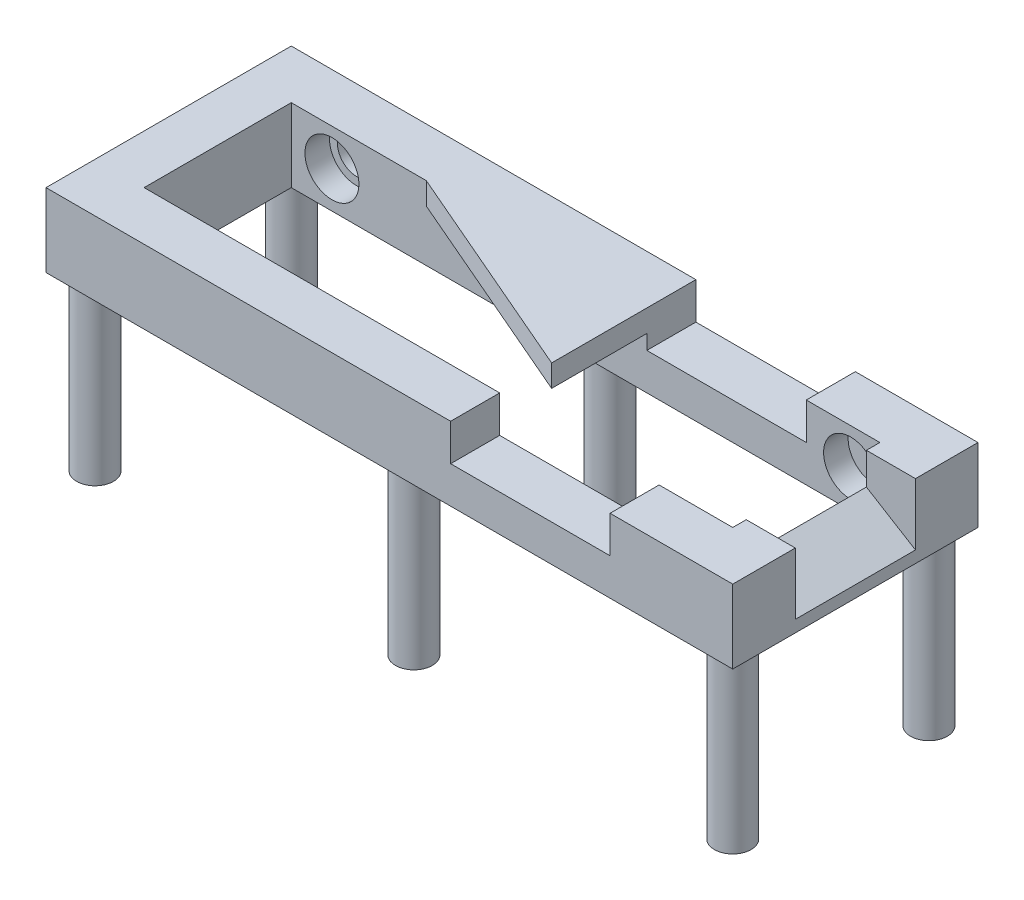
ISO-10303-21;
HEADER;
FILE_DESCRIPTION(('STEP AP214'),'2;1');
FILE_NAME('part.step','',(''),(''),'','','');
FILE_SCHEMA(('AUTOMOTIVE_DESIGN { 1 0 10303 214 1 1 1 1 }'));
ENDSEC;
DATA;
#1=APPLICATION_CONTEXT('core data for automotive mechanical design processes');
#2=APPLICATION_PROTOCOL_DEFINITION('international standard','automotive_design',2000,#1);
#3=PRODUCT_CONTEXT('',#1,'mechanical');
#4=PRODUCT('Part','Part','',(#3));
#5=PRODUCT_RELATED_PRODUCT_CATEGORY('part','',(#4));
#6=PRODUCT_DEFINITION_FORMATION('','',#4);
#7=PRODUCT_DEFINITION_CONTEXT('part definition',#1,'design');
#8=PRODUCT_DEFINITION('design','',#6,#7);
#9=PRODUCT_DEFINITION_SHAPE('','',#8);
#10=(LENGTH_UNIT() NAMED_UNIT(*) SI_UNIT(.MILLI.,.METRE.));
#11=(NAMED_UNIT(*) PLANE_ANGLE_UNIT() SI_UNIT($,.RADIAN.));
#12=(NAMED_UNIT(*) SI_UNIT($,.STERADIAN.) SOLID_ANGLE_UNIT());
#13=UNCERTAINTY_MEASURE_WITH_UNIT(LENGTH_MEASURE(1.E-05),#10,'distance_accuracy_value','');
#14=(GEOMETRIC_REPRESENTATION_CONTEXT(3) GLOBAL_UNCERTAINTY_ASSIGNED_CONTEXT((#13)) GLOBAL_UNIT_ASSIGNED_CONTEXT((#10,
#11,#12)) REPRESENTATION_CONTEXT('',''));
#15=CARTESIAN_POINT('',(0.,0.,0.));
#16=DIRECTION('',(0.,0.,1.));
#17=DIRECTION('',(1.,0.,0.));
#18=AXIS2_PLACEMENT_3D('',#15,#16,#17);
#19=CARTESIAN_POINT('',(0.,30.,0.));
#20=DIRECTION('',(0.,-1.,0.));
#21=DIRECTION('',(0.,0.,-1.));
#22=AXIS2_PLACEMENT_3D('',#19,#20,#21);
#23=PLANE('',#22);
#24=DIRECTION('',(-1.,0.,0.));
#25=VECTOR('',#24,1.);
#26=CARTESIAN_POINT('',(0.,30.,-54.5));
#27=LINE('',#26,#25);
#28=CARTESIAN_POINT('',(260.,30.,-54.5));
#29=VERTEX_POINT('',#28);
#30=CARTESIAN_POINT('',(240.,30.,-54.5));
#31=VERTEX_POINT('',#30);
#32=EDGE_CURVE('E324',#29,#31,#27,.T.);
#33=ORIENTED_EDGE('',*,*,#32,.F.);
#34=DIRECTION('',(0.,0.,-1.));
#35=VECTOR('',#34,1.);
#36=CARTESIAN_POINT('',(260.,30.,20.));
#37=LINE('',#36,#35);
#38=CARTESIAN_POINT('',(260.,30.,-80.));
#39=VERTEX_POINT('',#38);
#40=EDGE_CURVE('E257',#29,#39,#37,.T.);
#41=ORIENTED_EDGE('',*,*,#40,.T.);
#42=DIRECTION('',(-1.,0.,0.));
#43=VECTOR('',#42,1.);
#44=CARTESIAN_POINT('',(-20.,30.,-80.));
#45=LINE('',#44,#43);
#46=CARTESIAN_POINT('',(209.978221097427,30.,-80.));
#47=VERTEX_POINT('',#46);
#48=EDGE_CURVE('E262',#39,#47,#45,.T.);
#49=ORIENTED_EDGE('',*,*,#48,.T.);
#50=DIRECTION('',(0.,0.,1.));
#51=VECTOR('',#50,1.);
#52=CARTESIAN_POINT('',(209.978221097427,30.,-99.));
#53=LINE('',#52,#51);
#54=CARTESIAN_POINT('',(209.978221097427,30.,-60.));
#55=VERTEX_POINT('',#54);
#56=EDGE_CURVE('E345',#47,#55,#53,.T.);
#57=ORIENTED_EDGE('',*,*,#56,.T.);
#58=DIRECTION('',(-1.,0.,0.));
#59=VECTOR('',#58,1.);
#60=CARTESIAN_POINT('',(0.,30.,-59.9999999999999));
#61=LINE('',#60,#59);
#62=CARTESIAN_POINT('',(240.,30.,-60.));
#63=VERTEX_POINT('',#62);
#64=EDGE_CURVE('E218',#63,#55,#61,.T.);
#65=ORIENTED_EDGE('',*,*,#64,.F.);
#66=DIRECTION('',(0.,0.,-1.));
#67=VECTOR('',#66,1.);
#68=CARTESIAN_POINT('',(240.,30.,0.));
#69=LINE('',#68,#67);
#70=EDGE_CURVE('E224',#31,#63,#69,.T.);
#71=ORIENTED_EDGE('',*,*,#70,.F.);
#72=EDGE_LOOP('',(#33,#41,#49,#57,#65,#71));
#73=FACE_BOUND('',#72,.T.);
#74=ADVANCED_FACE('F36',(#73),#23,.F.);
#75=CARTESIAN_POINT('',(260.,30.,20.));
#76=DIRECTION('',(-1.,0.,0.));
#77=DIRECTION('',(0.,0.,1.));
#78=AXIS2_PLACEMENT_3D('',#75,#76,#77);
#79=PLANE('',#78);
#80=DIRECTION('',(0.,1.,0.));
#81=VECTOR('',#80,1.);
#82=CARTESIAN_POINT('',(260.,0.,-54.5));
#83=LINE('',#82,#81);
#84=CARTESIAN_POINT('',(260.,4.80107313806603,-54.5));
#85=VERTEX_POINT('',#84);
#86=EDGE_CURVE('E330',#85,#29,#83,.T.);
#87=ORIENTED_EDGE('',*,*,#86,.F.);
#88=DIRECTION('',(0.,0.,1.));
#89=VECTOR('',#88,1.);
#90=CARTESIAN_POINT('',(260.,4.80107313806603,-54.5));
#91=LINE('',#90,#89);
#92=CARTESIAN_POINT('',(260.,4.80107313806603,-5.49999999999998));
#93=VERTEX_POINT('',#92);
#94=EDGE_CURVE('E325',#85,#93,#91,.T.);
#95=ORIENTED_EDGE('',*,*,#94,.T.);
#96=DIRECTION('',(0.,1.,0.));
#97=VECTOR('',#96,1.);
#98=CARTESIAN_POINT('',(260.,0.,-5.49999999999998));
#99=LINE('',#98,#97);
#100=CARTESIAN_POINT('',(260.,30.,-5.49999999999998));
#101=VERTEX_POINT('',#100);
#102=EDGE_CURVE('E488',#93,#101,#99,.T.);
#103=ORIENTED_EDGE('',*,*,#102,.T.);
#104=CARTESIAN_POINT('',(260.,30.,20.));
#105=VERTEX_POINT('',#104);
#106=EDGE_CURVE('E258',#105,#101,#37,.T.);
#107=ORIENTED_EDGE('',*,*,#106,.F.);
#108=DIRECTION('',(0.,-1.,0.));
#109=VECTOR('',#108,1.);
#110=CARTESIAN_POINT('',(260.,30.,20.));
#111=LINE('',#110,#109);
#112=CARTESIAN_POINT('',(260.,0.,20.));
#113=VERTEX_POINT('',#112);
#114=EDGE_CURVE('E278',#105,#113,#111,.T.);
#115=ORIENTED_EDGE('',*,*,#114,.T.);
#116=DIRECTION('',(0.,0.,-1.));
#117=VECTOR('',#116,1.);
#118=CARTESIAN_POINT('',(260.,0.,20.));
#119=LINE('',#118,#117);
#120=CARTESIAN_POINT('',(260.,0.,-80.));
#121=VERTEX_POINT('',#120);
#122=EDGE_CURVE('E270',#113,#121,#119,.T.);
#123=ORIENTED_EDGE('',*,*,#122,.T.);
#124=DIRECTION('',(0.,-1.,0.));
#125=VECTOR('',#124,1.);
#126=CARTESIAN_POINT('',(260.,30.,-80.));
#127=LINE('',#126,#125);
#128=EDGE_CURVE('E275',#39,#121,#127,.T.);
#129=ORIENTED_EDGE('',*,*,#128,.F.);
#130=ORIENTED_EDGE('',*,*,#40,.F.);
#131=EDGE_LOOP('',(#87,#95,#103,#107,#115,#123,#129,#130));
#132=FACE_BOUND('',#131,.T.);
#133=ADVANCED_FACE('F492',(#132),#79,.F.);
#134=CARTESIAN_POINT('',(240.,30.,0.));
#135=DIRECTION('',(-1.,0.,0.));
#136=DIRECTION('',(0.,0.,1.));
#137=AXIS2_PLACEMENT_3D('',#134,#135,#136);
#138=PLANE('',#137);
#139=DIRECTION('',(0.,0.,1.));
#140=VECTOR('',#139,1.);
#141=CARTESIAN_POINT('',(240.,17.0214416943566,0.));
#142=LINE('',#141,#140);
#143=CARTESIAN_POINT('',(240.,17.0214416943566,-54.5));
#144=VERTEX_POINT('',#143);
#145=CARTESIAN_POINT('',(240.,17.0214416943566,-5.49999999999998));
#146=VERTEX_POINT('',#145);
#147=EDGE_CURVE('E45',#144,#146,#142,.T.);
#148=ORIENTED_EDGE('',*,*,#147,.F.);
#149=DIRECTION('',(0.,1.,0.));
#150=VECTOR('',#149,1.);
#151=CARTESIAN_POINT('',(240.,30.,-54.5));
#152=LINE('',#151,#150);
#153=EDGE_CURVE('E11',#144,#31,#152,.T.);
#154=ORIENTED_EDGE('',*,*,#153,.T.);
#155=ORIENTED_EDGE('',*,*,#70,.T.);
#156=DIRECTION('',(0.,-1.,0.));
#157=VECTOR('',#156,1.);
#158=CARTESIAN_POINT('',(240.,30.,-60.));
#159=LINE('',#158,#157);
#160=CARTESIAN_POINT('',(240.,0.,-60.));
#161=VERTEX_POINT('',#160);
#162=EDGE_CURVE('E242',#63,#161,#159,.T.);
#163=ORIENTED_EDGE('',*,*,#162,.T.);
#164=DIRECTION('',(0.,0.,-1.));
#165=VECTOR('',#164,1.);
#166=CARTESIAN_POINT('',(240.,0.,0.));
#167=LINE('',#166,#165);
#168=CARTESIAN_POINT('',(240.,0.,0.));
#169=VERTEX_POINT('',#168);
#170=EDGE_CURVE('E235',#169,#161,#167,.T.);
#171=ORIENTED_EDGE('',*,*,#170,.F.);
#172=DIRECTION('',(0.,-1.,0.));
#173=VECTOR('',#172,1.);
#174=CARTESIAN_POINT('',(240.,30.,0.));
#175=LINE('',#174,#173);
#176=CARTESIAN_POINT('',(240.,30.,0.));
#177=VERTEX_POINT('',#176);
#178=EDGE_CURVE('E244',#177,#169,#175,.T.);
#179=ORIENTED_EDGE('',*,*,#178,.F.);
#180=CARTESIAN_POINT('',(240.,30.,-5.49999999999998));
#181=VERTEX_POINT('',#180);
#182=EDGE_CURVE('E219',#177,#181,#69,.T.);
#183=ORIENTED_EDGE('',*,*,#182,.T.);
#184=DIRECTION('',(0.,1.,0.));
#185=VECTOR('',#184,1.);
#186=CARTESIAN_POINT('',(240.,30.,-5.49999999999998));
#187=LINE('',#186,#185);
#188=EDGE_CURVE('E303',#146,#181,#187,.T.);
#189=ORIENTED_EDGE('',*,*,#188,.F.);
#190=EDGE_LOOP('',(#148,#154,#155,#163,#171,#179,#183,#189));
#191=FACE_BOUND('',#190,.T.);
#192=ADVANCED_FACE('F313',(#191),#138,.T.);
#193=DIRECTION('',(1.,0.,0.));
#194=VECTOR('',#193,1.);
#195=CARTESIAN_POINT('',(-20.,30.,20.));
#196=LINE('',#195,#194);
#197=CARTESIAN_POINT('',(-20.,30.,20.));
#198=VERTEX_POINT('',#197);
#199=CARTESIAN_POINT('',(144.978221097427,30.,20.));
#200=VERTEX_POINT('',#199);
#201=EDGE_CURVE('E255',#198,#200,#196,.T.);
#202=ORIENTED_EDGE('',*,*,#201,.T.);
#203=DIRECTION('',(0.,0.,1.));
#204=VECTOR('',#203,1.);
#205=CARTESIAN_POINT('',(144.978221097427,30.,-99.));
#206=LINE('',#205,#204);
#207=CARTESIAN_POINT('',(144.978221097427,30.,0.));
#208=VERTEX_POINT('',#207);
#209=EDGE_CURVE('E342',#208,#200,#206,.T.);
#210=ORIENTED_EDGE('',*,*,#209,.F.);
#211=DIRECTION('',(1.,0.,0.));
#212=VECTOR('',#211,1.);
#213=CARTESIAN_POINT('',(0.,30.,0.));
#214=LINE('',#213,#212);
#215=CARTESIAN_POINT('',(0.,30.,0.));
#216=VERTEX_POINT('',#215);
#217=EDGE_CURVE('E430',#216,#208,#214,.T.);
#218=ORIENTED_EDGE('',*,*,#217,.F.);
#219=DIRECTION('',(0.,0.,1.));
#220=VECTOR('',#219,1.);
#221=CARTESIAN_POINT('',(0.,30.,0.));
#222=LINE('',#221,#220);
#223=CARTESIAN_POINT('',(0.,30.,-59.9999999999999));
#224=VERTEX_POINT('',#223);
#225=EDGE_CURVE('E217',#224,#216,#222,.T.);
#226=ORIENTED_EDGE('',*,*,#225,.F.);
#227=CARTESIAN_POINT('',(55.057032044271,30.,-60.));
#228=VERTEX_POINT('',#227);
#229=EDGE_CURVE('E209',#228,#224,#61,.T.);
#230=ORIENTED_EDGE('',*,*,#229,.F.);
#231=DIRECTION('',(0.918082968206384,0.,0.396388273652683));
#232=VECTOR('',#231,1.);
#233=CARTESIAN_POINT('',(55.057032044271,30.,-60.));
#234=LINE('',#233,#232);
#235=CARTESIAN_POINT('',(144.978221097427,30.,-21.1759436478682));
#236=VERTEX_POINT('',#235);
#237=EDGE_CURVE('E192',#228,#236,#234,.T.);
#238=ORIENTED_EDGE('',*,*,#237,.T.);
#239=CARTESIAN_POINT('',(144.978221097427,30.,-80.));
#240=VERTEX_POINT('',#239);
#241=EDGE_CURVE('E344',#240,#236,#206,.T.);
#242=ORIENTED_EDGE('',*,*,#241,.F.);
#243=CARTESIAN_POINT('',(-20.,30.,-80.));
#244=VERTEX_POINT('',#243);
#245=EDGE_CURVE('E261',#240,#244,#45,.T.);
#246=ORIENTED_EDGE('',*,*,#245,.T.);
#247=DIRECTION('',(0.,0.,1.));
#248=VECTOR('',#247,1.);
#249=CARTESIAN_POINT('',(-20.,30.,20.));
#250=LINE('',#249,#248);
#251=EDGE_CURVE('E250',#244,#198,#250,.T.);
#252=ORIENTED_EDGE('',*,*,#251,.T.);
#253=EDGE_LOOP('',(#202,#210,#218,#226,#230,#238,#242,#246,#252));
#254=FACE_BOUND('',#253,.T.);
#255=ADVANCED_FACE('F215',(#254),#23,.F.);
#256=ORIENTED_EDGE('',*,*,#106,.T.);
#257=DIRECTION('',(-1.,0.,0.));
#258=VECTOR('',#257,1.);
#259=CARTESIAN_POINT('',(0.,30.,-5.49999999999998));
#260=LINE('',#259,#258);
#261=EDGE_CURVE('E318',#101,#181,#260,.T.);
#262=ORIENTED_EDGE('',*,*,#261,.T.);
#263=ORIENTED_EDGE('',*,*,#182,.F.);
#264=CARTESIAN_POINT('',(209.978221097427,30.,0.));
#265=VERTEX_POINT('',#264);
#266=EDGE_CURVE('E429',#265,#177,#214,.T.);
#267=ORIENTED_EDGE('',*,*,#266,.F.);
#268=CARTESIAN_POINT('',(209.978221097427,30.,20.));
#269=VERTEX_POINT('',#268);
#270=EDGE_CURVE('E346',#265,#269,#53,.T.);
#271=ORIENTED_EDGE('',*,*,#270,.T.);
#272=EDGE_CURVE('E253',#269,#105,#196,.T.);
#273=ORIENTED_EDGE('',*,*,#272,.T.);
#274=EDGE_LOOP('',(#256,#262,#263,#267,#271,#273));
#275=FACE_BOUND('',#274,.T.);
#276=ADVANCED_FACE('F321',(#275),#23,.F.);
#277=CARTESIAN_POINT('',(0.,0.,0.));
#278=DIRECTION('',(0.,-1.,0.));
#279=DIRECTION('',(0.,0.,-1.));
#280=AXIS2_PLACEMENT_3D('',#277,#278,#279);
#281=PLANE('',#280);
#282=CARTESIAN_POINT('',(120.,0.,-70.));
#283=DIRECTION('',(0.,-1.,0.));
#284=DIRECTION('',(0.,0.,-1.));
#285=AXIS2_PLACEMENT_3D('',#282,#283,#284);
#286=CIRCLE('',#285,7.50000000000001);
#287=CARTESIAN_POINT('',(120.,0.,-77.5));
#288=VERTEX_POINT('',#287);
#289=EDGE_CURVE('E394',#288,#288,#286,.T.);
#290=ORIENTED_EDGE('',*,*,#289,.F.);
#291=EDGE_LOOP('',(#290));
#292=FACE_BOUND('',#291,.T.);
#293=CARTESIAN_POINT('',(120.,0.,10.));
#294=DIRECTION('',(0.,-1.,0.));
#295=DIRECTION('',(0.,0.,-1.));
#296=AXIS2_PLACEMENT_3D('',#293,#294,#295);
#297=CIRCLE('',#296,7.50000000000001);
#298=CARTESIAN_POINT('',(120.,0.,2.49999999999999));
#299=VERTEX_POINT('',#298);
#300=EDGE_CURVE('E398',#299,#299,#297,.T.);
#301=ORIENTED_EDGE('',*,*,#300,.F.);
#302=EDGE_LOOP('',(#301));
#303=FACE_BOUND('',#302,.T.);
#304=CARTESIAN_POINT('',(250.,0.,-70.));
#305=DIRECTION('',(0.,-1.,0.));
#306=DIRECTION('',(0.,0.,-1.));
#307=AXIS2_PLACEMENT_3D('',#304,#305,#306);
#308=CIRCLE('',#307,7.50000000000001);
#309=CARTESIAN_POINT('',(250.,0.,-77.5));
#310=VERTEX_POINT('',#309);
#311=EDGE_CURVE('E404',#310,#310,#308,.T.);
#312=ORIENTED_EDGE('',*,*,#311,.F.);
#313=EDGE_LOOP('',(#312));
#314=FACE_BOUND('',#313,.T.);
#315=CARTESIAN_POINT('',(-10.,0.,-70.));
#316=DIRECTION('',(0.,-1.,0.));
#317=DIRECTION('',(0.,0.,1.));
#318=AXIS2_PLACEMENT_3D('',#315,#316,#317);
#319=CIRCLE('',#318,7.5);
#320=CARTESIAN_POINT('',(-10.,0.,-62.5));
#321=VERTEX_POINT('',#320);
#322=EDGE_CURVE('E410',#321,#321,#319,.T.);
#323=ORIENTED_EDGE('',*,*,#322,.F.);
#324=EDGE_LOOP('',(#323));
#325=FACE_BOUND('',#324,.T.);
#326=CARTESIAN_POINT('',(250.,0.,10.));
#327=DIRECTION('',(0.,-1.,0.));
#328=DIRECTION('',(0.,0.,1.));
#329=AXIS2_PLACEMENT_3D('',#326,#327,#328);
#330=CIRCLE('',#329,7.50000000000001);
#331=CARTESIAN_POINT('',(250.,0.,17.5));
#332=VERTEX_POINT('',#331);
#333=EDGE_CURVE('E416',#332,#332,#330,.T.);
#334=ORIENTED_EDGE('',*,*,#333,.F.);
#335=EDGE_LOOP('',(#334));
#336=FACE_BOUND('',#335,.T.);
#337=CARTESIAN_POINT('',(-10.,0.,10.));
#338=DIRECTION('',(0.,-1.,0.));
#339=DIRECTION('',(0.,0.,-1.));
#340=AXIS2_PLACEMENT_3D('',#337,#338,#339);
#341=CIRCLE('',#340,7.5);
#342=CARTESIAN_POINT('',(-10.,0.,2.5));
#343=VERTEX_POINT('',#342);
#344=EDGE_CURVE('E422',#343,#343,#341,.T.);
#345=ORIENTED_EDGE('',*,*,#344,.F.);
#346=EDGE_LOOP('',(#345));
#347=FACE_BOUND('',#346,.T.);
#348=DIRECTION('',(0.,0.,1.));
#349=VECTOR('',#348,1.);
#350=CARTESIAN_POINT('',(-20.,0.,20.));
#351=LINE('',#350,#349);
#352=CARTESIAN_POINT('',(-20.,0.,-80.));
#353=VERTEX_POINT('',#352);
#354=CARTESIAN_POINT('',(-20.,0.,20.));
#355=VERTEX_POINT('',#354);
#356=EDGE_CURVE('E249',#353,#355,#351,.T.);
#357=ORIENTED_EDGE('',*,*,#356,.F.);
#358=DIRECTION('',(-1.,0.,0.));
#359=VECTOR('',#358,1.);
#360=CARTESIAN_POINT('',(-20.,0.,-80.));
#361=LINE('',#360,#359);
#362=EDGE_CURVE('E254',#121,#353,#361,.T.);
#363=ORIENTED_EDGE('',*,*,#362,.F.);
#364=ORIENTED_EDGE('',*,*,#122,.F.);
#365=DIRECTION('',(1.,0.,0.));
#366=VECTOR('',#365,1.);
#367=CARTESIAN_POINT('',(-20.,0.,20.));
#368=LINE('',#367,#366);
#369=EDGE_CURVE('E268',#355,#113,#368,.T.);
#370=ORIENTED_EDGE('',*,*,#369,.F.);
#371=EDGE_LOOP('',(#357,#363,#364,#370));
#372=FACE_BOUND('',#371,.T.);
#373=DIRECTION('',(-1.,0.,0.));
#374=VECTOR('',#373,1.);
#375=CARTESIAN_POINT('',(0.,0.,-59.9999999999999));
#376=LINE('',#375,#374);
#377=CARTESIAN_POINT('',(0.,0.,-59.9999999999999));
#378=VERTEX_POINT('',#377);
#379=EDGE_CURVE('E238',#161,#378,#376,.T.);
#380=ORIENTED_EDGE('',*,*,#379,.T.);
#381=DIRECTION('',(0.,0.,1.));
#382=VECTOR('',#381,1.);
#383=CARTESIAN_POINT('',(0.,0.,0.));
#384=LINE('',#383,#382);
#385=CARTESIAN_POINT('',(0.,0.,0.));
#386=VERTEX_POINT('',#385);
#387=EDGE_CURVE('E228',#378,#386,#384,.T.);
#388=ORIENTED_EDGE('',*,*,#387,.T.);
#389=DIRECTION('',(1.,0.,0.));
#390=VECTOR('',#389,1.);
#391=CARTESIAN_POINT('',(0.,0.,0.));
#392=LINE('',#391,#390);
#393=EDGE_CURVE('E231',#386,#169,#392,.T.);
#394=ORIENTED_EDGE('',*,*,#393,.T.);
#395=ORIENTED_EDGE('',*,*,#170,.T.);
#396=EDGE_LOOP('',(#380,#388,#394,#395));
#397=FACE_BOUND('',#396,.T.);
#398=ADVANCED_FACE('F443',(#292,#303,#314,#325,#336,#347,#372,#397),#281,.T.);
#399=CARTESIAN_POINT('',(-20.,30.,20.));
#400=DIRECTION('',(1.,0.,0.));
#401=DIRECTION('',(0.,0.,-1.));
#402=AXIS2_PLACEMENT_3D('',#399,#400,#401);
#403=PLANE('',#402);
#404=ORIENTED_EDGE('',*,*,#356,.T.);
#405=DIRECTION('',(0.,-1.,0.));
#406=VECTOR('',#405,1.);
#407=CARTESIAN_POINT('',(-20.,30.,20.));
#408=LINE('',#407,#406);
#409=EDGE_CURVE('E281',#198,#355,#408,.T.);
#410=ORIENTED_EDGE('',*,*,#409,.F.);
#411=ORIENTED_EDGE('',*,*,#251,.F.);
#412=DIRECTION('',(0.,-1.,0.));
#413=VECTOR('',#412,1.);
#414=CARTESIAN_POINT('',(-20.,30.,-80.));
#415=LINE('',#414,#413);
#416=EDGE_CURVE('E265',#244,#353,#415,.T.);
#417=ORIENTED_EDGE('',*,*,#416,.T.);
#418=EDGE_LOOP('',(#404,#410,#411,#417));
#419=FACE_BOUND('',#418,.T.);
#420=ADVANCED_FACE('F38',(#419),#403,.F.);
#421=CARTESIAN_POINT('',(-20.,30.,20.));
#422=DIRECTION('',(0.,0.,-1.));
#423=DIRECTION('',(-1.,0.,0.));
#424=AXIS2_PLACEMENT_3D('',#421,#422,#423);
#425=PLANE('',#424);
#426=DIRECTION('',(1.,0.,0.));
#427=VECTOR('',#426,1.);
#428=CARTESIAN_POINT('',(144.978221097427,15.,20.));
#429=LINE('',#428,#427);
#430=CARTESIAN_POINT('',(144.978221097427,15.,20.));
#431=VERTEX_POINT('',#430);
#432=CARTESIAN_POINT('',(209.978221097427,15.,20.));
#433=VERTEX_POINT('',#432);
#434=EDGE_CURVE('E336',#431,#433,#429,.T.);
#435=ORIENTED_EDGE('',*,*,#434,.F.);
#436=DIRECTION('',(0.,-1.,0.));
#437=VECTOR('',#436,1.);
#438=CARTESIAN_POINT('',(144.978221097427,30.,20.));
#439=LINE('',#438,#437);
#440=EDGE_CURVE('E327',#200,#431,#439,.T.);
#441=ORIENTED_EDGE('',*,*,#440,.F.);
#442=ORIENTED_EDGE('',*,*,#201,.F.);
#443=ORIENTED_EDGE('',*,*,#409,.T.);
#444=ORIENTED_EDGE('',*,*,#369,.T.);
#445=ORIENTED_EDGE('',*,*,#114,.F.);
#446=ORIENTED_EDGE('',*,*,#272,.F.);
#447=DIRECTION('',(0.,1.,0.));
#448=VECTOR('',#447,1.);
#449=CARTESIAN_POINT('',(209.978221097427,15.,20.));
#450=LINE('',#449,#448);
#451=EDGE_CURVE('E339',#433,#269,#450,.T.);
#452=ORIENTED_EDGE('',*,*,#451,.F.);
#453=EDGE_LOOP('',(#435,#441,#442,#443,#444,#445,#446,#452));
#454=FACE_BOUND('',#453,.T.);
#455=ADVANCED_FACE('F509',(#454),#425,.F.);
#456=CARTESIAN_POINT('',(-20.,30.,-80.));
#457=DIRECTION('',(0.,0.,1.));
#458=DIRECTION('',(1.,0.,0.));
#459=AXIS2_PLACEMENT_3D('',#456,#457,#458);
#460=PLANE('',#459);
#461=CARTESIAN_POINT('',(16.5795411374058,15.,-80.));
#462=DIRECTION('',(0.,0.,-1.));
#463=DIRECTION('',(-1.,0.,0.));
#464=AXIS2_PLACEMENT_3D('',#461,#462,#463);
#465=CIRCLE('',#464,7.75);
#466=CARTESIAN_POINT('',(8.82954113740582,15.,-80.));
#467=VERTEX_POINT('',#466);
#468=EDGE_CURVE('E897',#467,#467,#465,.T.);
#469=ORIENTED_EDGE('',*,*,#468,.F.);
#470=EDGE_LOOP('',(#469));
#471=FACE_BOUND('',#470,.T.);
#472=ORIENTED_EDGE('',*,*,#245,.F.);
#473=DIRECTION('',(0.,-1.,0.));
#474=VECTOR('',#473,1.);
#475=CARTESIAN_POINT('',(144.978221097427,30.,-80.));
#476=LINE('',#475,#474);
#477=CARTESIAN_POINT('',(144.978221097427,15.,-80.));
#478=VERTEX_POINT('',#477);
#479=EDGE_CURVE('E367',#240,#478,#476,.T.);
#480=ORIENTED_EDGE('',*,*,#479,.T.);
#481=DIRECTION('',(1.,0.,0.));
#482=VECTOR('',#481,1.);
#483=CARTESIAN_POINT('',(-20.,15.,-80.));
#484=LINE('',#483,#482);
#485=CARTESIAN_POINT('',(209.978221097427,15.,-80.));
#486=VERTEX_POINT('',#485);
#487=EDGE_CURVE('E356',#478,#486,#484,.T.);
#488=ORIENTED_EDGE('',*,*,#487,.T.);
#489=DIRECTION('',(0.,1.,0.));
#490=VECTOR('',#489,1.);
#491=CARTESIAN_POINT('',(209.978221097427,30.,-80.));
#492=LINE('',#491,#490);
#493=EDGE_CURVE('E362',#486,#47,#492,.T.);
#494=ORIENTED_EDGE('',*,*,#493,.T.);
#495=ORIENTED_EDGE('',*,*,#48,.F.);
#496=ORIENTED_EDGE('',*,*,#128,.T.);
#497=ORIENTED_EDGE('',*,*,#362,.T.);
#498=ORIENTED_EDGE('',*,*,#416,.F.);
#499=EDGE_LOOP('',(#472,#480,#488,#494,#495,#496,#497,#498));
#500=FACE_BOUND('',#499,.T.);
#501=ADVANCED_FACE('F459',(#471,#500),#460,.F.);
#502=CARTESIAN_POINT('',(0.,30.,0.));
#503=DIRECTION('',(1.,0.,0.));
#504=DIRECTION('',(0.,0.,-1.));
#505=AXIS2_PLACEMENT_3D('',#502,#503,#504);
#506=PLANE('',#505);
#507=ORIENTED_EDGE('',*,*,#387,.F.);
#508=DIRECTION('',(0.,-1.,0.));
#509=VECTOR('',#508,1.);
#510=CARTESIAN_POINT('',(0.,30.,-59.9999999999999));
#511=LINE('',#510,#509);
#512=EDGE_CURVE('E222',#224,#378,#511,.T.);
#513=ORIENTED_EDGE('',*,*,#512,.F.);
#514=ORIENTED_EDGE('',*,*,#225,.T.);
#515=DIRECTION('',(0.,-1.,0.));
#516=VECTOR('',#515,1.);
#517=CARTESIAN_POINT('',(0.,30.,0.));
#518=LINE('',#517,#516);
#519=EDGE_CURVE('E246',#216,#386,#518,.T.);
#520=ORIENTED_EDGE('',*,*,#519,.T.);
#521=EDGE_LOOP('',(#507,#513,#514,#520));
#522=FACE_BOUND('',#521,.T.);
#523=ADVANCED_FACE('F445',(#522),#506,.T.);
#524=CARTESIAN_POINT('',(0.,30.,0.));
#525=DIRECTION('',(0.,0.,-1.));
#526=DIRECTION('',(-1.,0.,0.));
#527=AXIS2_PLACEMENT_3D('',#524,#525,#526);
#528=PLANE('',#527);
#529=DIRECTION('',(0.,1.,0.));
#530=VECTOR('',#529,1.);
#531=CARTESIAN_POINT('',(144.978221097427,30.,0.));
#532=LINE('',#531,#530);
#533=CARTESIAN_POINT('',(144.978221097427,15.,0.));
#534=VERTEX_POINT('',#533);
#535=EDGE_CURVE('E365',#534,#208,#532,.T.);
#536=ORIENTED_EDGE('',*,*,#535,.F.);
#537=DIRECTION('',(-1.,0.,0.));
#538=VECTOR('',#537,1.);
#539=CARTESIAN_POINT('',(0.,15.,0.));
#540=LINE('',#539,#538);
#541=CARTESIAN_POINT('',(209.978221097427,15.,0.));
#542=VERTEX_POINT('',#541);
#543=EDGE_CURVE('E354',#542,#534,#540,.T.);
#544=ORIENTED_EDGE('',*,*,#543,.F.);
#545=DIRECTION('',(0.,-1.,0.));
#546=VECTOR('',#545,1.);
#547=CARTESIAN_POINT('',(209.978221097427,30.,0.));
#548=LINE('',#547,#546);
#549=EDGE_CURVE('E359',#265,#542,#548,.T.);
#550=ORIENTED_EDGE('',*,*,#549,.F.);
#551=ORIENTED_EDGE('',*,*,#266,.T.);
#552=ORIENTED_EDGE('',*,*,#178,.T.);
#553=ORIENTED_EDGE('',*,*,#393,.F.);
#554=ORIENTED_EDGE('',*,*,#519,.F.);
#555=ORIENTED_EDGE('',*,*,#217,.T.);
#556=EDGE_LOOP('',(#536,#544,#550,#551,#552,#553,#554,#555));
#557=FACE_BOUND('',#556,.T.);
#558=CARTESIAN_POINT('',(228.036930768266,15.,0.));
#559=DIRECTION('',(0.,0.,-1.));
#560=DIRECTION('',(-1.,0.,0.));
#561=AXIS2_PLACEMENT_3D('',#558,#559,#560);
#562=CIRCLE('',#561,11.);
#563=CARTESIAN_POINT('',(217.036930768266,15.,0.));
#564=VERTEX_POINT('',#563);
#565=EDGE_CURVE('E297',#564,#564,#562,.T.);
#566=ORIENTED_EDGE('',*,*,#565,.F.);
#567=EDGE_LOOP('',(#566));
#568=FACE_BOUND('',#567,.T.);
#569=CARTESIAN_POINT('',(16.5795411374058,15.,0.));
#570=DIRECTION('',(0.,0.,-1.));
#571=DIRECTION('',(-1.,0.,0.));
#572=AXIS2_PLACEMENT_3D('',#569,#570,#571);
#573=CIRCLE('',#572,11.);
#574=CARTESIAN_POINT('',(5.57954113740582,15.,0.));
#575=VERTEX_POINT('',#574);
#576=EDGE_CURVE('E293',#575,#575,#573,.T.);
#577=ORIENTED_EDGE('',*,*,#576,.F.);
#578=EDGE_LOOP('',(#577));
#579=FACE_BOUND('',#578,.T.);
#580=CARTESIAN_POINT('',(95.4698805058518,15.,0.));
#581=DIRECTION('',(0.,0.,-1.));
#582=DIRECTION('',(-1.,0.,0.));
#583=AXIS2_PLACEMENT_3D('',#580,#581,#582);
#584=CIRCLE('',#583,11.);
#585=CARTESIAN_POINT('',(84.4698805058518,15.,0.));
#586=VERTEX_POINT('',#585);
#587=EDGE_CURVE('E288',#586,#586,#584,.T.);
#588=ORIENTED_EDGE('',*,*,#587,.F.);
#589=EDGE_LOOP('',(#588));
#590=FACE_BOUND('',#589,.T.);
#591=ADVANCED_FACE('F436',(#557,#568,#579,#590),#528,.T.);
#592=CARTESIAN_POINT('',(0.,30.,-59.9999999999999));
#593=DIRECTION('',(0.,0.,1.));
#594=DIRECTION('',(1.,0.,0.));
#595=AXIS2_PLACEMENT_3D('',#592,#593,#594);
#596=PLANE('',#595);
#597=DIRECTION('',(0.,1.,0.));
#598=VECTOR('',#597,1.);
#599=CARTESIAN_POINT('',(55.057032044271,21.,-60.));
#600=LINE('',#599,#598);
#601=CARTESIAN_POINT('',(55.057032044271,21.,-60.));
#602=VERTEX_POINT('',#601);
#603=EDGE_CURVE('E196',#602,#228,#600,.T.);
#604=ORIENTED_EDGE('',*,*,#603,.T.);
#605=ORIENTED_EDGE('',*,*,#229,.T.);
#606=ORIENTED_EDGE('',*,*,#512,.T.);
#607=ORIENTED_EDGE('',*,*,#379,.F.);
#608=ORIENTED_EDGE('',*,*,#162,.F.);
#609=ORIENTED_EDGE('',*,*,#64,.T.);
#610=DIRECTION('',(0.,1.,0.));
#611=VECTOR('',#610,1.);
#612=CARTESIAN_POINT('',(209.978221097427,30.,-60.));
#613=LINE('',#612,#611);
#614=CARTESIAN_POINT('',(209.978221097427,15.,-60.));
#615=VERTEX_POINT('',#614);
#616=EDGE_CURVE('E299',#615,#55,#613,.T.);
#617=ORIENTED_EDGE('',*,*,#616,.F.);
#618=DIRECTION('',(1.,0.,0.));
#619=VECTOR('',#618,1.);
#620=CARTESIAN_POINT('',(0.,15.,-59.9999999999999));
#621=LINE('',#620,#619);
#622=CARTESIAN_POINT('',(144.978221097427,15.,-60.));
#623=VERTEX_POINT('',#622);
#624=EDGE_CURVE('E284',#623,#615,#621,.T.);
#625=ORIENTED_EDGE('',*,*,#624,.F.);
#626=DIRECTION('',(0.,-1.,0.));
#627=VECTOR('',#626,1.);
#628=CARTESIAN_POINT('',(144.978221097427,30.,-60.));
#629=LINE('',#628,#627);
#630=CARTESIAN_POINT('',(144.978221097427,21.,-60.));
#631=VERTEX_POINT('',#630);
#632=EDGE_CURVE('E301',#631,#623,#629,.T.);
#633=ORIENTED_EDGE('',*,*,#632,.F.);
#634=DIRECTION('',(-1.,0.,0.));
#635=VECTOR('',#634,1.);
#636=CARTESIAN_POINT('',(144.978221097427,21.,-60.));
#637=LINE('',#636,#635);
#638=CARTESIAN_POINT('',(104.689424963145,21.,-60.));
#639=VERTEX_POINT('',#638);
#640=EDGE_CURVE('E468',#631,#639,#637,.T.);
#641=ORIENTED_EDGE('',*,*,#640,.T.);
#642=CARTESIAN_POINT('',(95.4698805058518,15.,-60.));
#643=DIRECTION('',(0.,0.,1.));
#644=DIRECTION('',(1.,0.,0.));
#645=AXIS2_PLACEMENT_3D('',#642,#643,#644);
#646=CIRCLE('',#645,11.);
#647=CARTESIAN_POINT('',(86.2503360485589,21.,-60.));
#648=VERTEX_POINT('',#647);
#649=EDGE_CURVE('E289',#648,#639,#646,.T.);
#650=ORIENTED_EDGE('',*,*,#649,.F.);
#651=EDGE_CURVE('E202',#648,#602,#637,.T.);
#652=ORIENTED_EDGE('',*,*,#651,.T.);
#653=EDGE_LOOP('',(#604,#605,#606,#607,#608,#609,#617,#625,#633,#641,#650,#652));
#654=FACE_BOUND('',#653,.T.);
#655=CARTESIAN_POINT('',(228.036930768266,15.,-60.));
#656=DIRECTION('',(0.,0.,1.));
#657=DIRECTION('',(1.,0.,0.));
#658=AXIS2_PLACEMENT_3D('',#655,#656,#657);
#659=CIRCLE('',#658,11.);
#660=CARTESIAN_POINT('',(239.036930768266,15.,-60.));
#661=VERTEX_POINT('',#660);
#662=EDGE_CURVE('E294',#661,#661,#659,.T.);
#663=ORIENTED_EDGE('',*,*,#662,.F.);
#664=EDGE_LOOP('',(#663));
#665=FACE_BOUND('',#664,.T.);
#666=CARTESIAN_POINT('',(16.5795411374058,15.,-59.9999999999999));
#667=DIRECTION('',(0.,0.,1.));
#668=DIRECTION('',(1.,0.,0.));
#669=AXIS2_PLACEMENT_3D('',#666,#667,#668);
#670=CIRCLE('',#669,11.);
#671=CARTESIAN_POINT('',(27.5795411374058,15.,-59.9999999999999));
#672=VERTEX_POINT('',#671);
#673=EDGE_CURVE('E290',#672,#672,#670,.T.);
#674=ORIENTED_EDGE('',*,*,#673,.F.);
#675=EDGE_LOOP('',(#674));
#676=FACE_BOUND('',#675,.T.);
#677=ADVANCED_FACE('F206',(#654,#665,#676),#596,.T.);
#678=CARTESIAN_POINT('',(-10.,-70.,10.));
#679=DIRECTION('',(0.,1.,0.));
#680=DIRECTION('',(0.,0.,1.));
#681=AXIS2_PLACEMENT_3D('',#678,#679,#680);
#682=CYLINDRICAL_SURFACE('',#681,7.5);
#683=CARTESIAN_POINT('',(-10.,-70.,10.));
#684=DIRECTION('',(0.,-1.,0.));
#685=DIRECTION('',(0.,0.,-1.));
#686=AXIS2_PLACEMENT_3D('',#683,#684,#685);
#687=CIRCLE('',#686,7.5);
#688=CARTESIAN_POINT('',(-10.,-70.,2.5));
#689=VERTEX_POINT('',#688);
#690=EDGE_CURVE('E232',#689,#689,#687,.T.);
#691=ORIENTED_EDGE('',*,*,#690,.F.);
#692=EDGE_LOOP('',(#691));
#693=FACE_BOUND('',#692,.T.);
#694=ORIENTED_EDGE('',*,*,#344,.T.);
#695=EDGE_LOOP('',(#694));
#696=FACE_BOUND('',#695,.T.);
#697=ADVANCED_FACE('F582',(#693,#696),#682,.T.);
#698=CARTESIAN_POINT('',(-10.,-70.,10.));
#699=DIRECTION('',(0.,-1.,0.));
#700=DIRECTION('',(0.,0.,-1.));
#701=AXIS2_PLACEMENT_3D('',#698,#699,#700);
#702=PLANE('',#701);
#703=ORIENTED_EDGE('',*,*,#690,.T.);
#704=EDGE_LOOP('',(#703));
#705=FACE_BOUND('',#704,.T.);
#706=ADVANCED_FACE('F591',(#705),#702,.T.);
#707=CARTESIAN_POINT('',(250.,-70.,10.));
#708=DIRECTION('',(0.,1.,0.));
#709=DIRECTION('',(0.,0.,1.));
#710=AXIS2_PLACEMENT_3D('',#707,#708,#709);
#711=CYLINDRICAL_SURFACE('',#710,7.50000000000001);
#712=CARTESIAN_POINT('',(250.,-70.,10.));
#713=DIRECTION('',(0.,-1.,0.));
#714=DIRECTION('',(0.,0.,1.));
#715=AXIS2_PLACEMENT_3D('',#712,#713,#714);
#716=CIRCLE('',#715,7.50000000000001);
#717=CARTESIAN_POINT('',(250.,-70.,17.5));
#718=VERTEX_POINT('',#717);
#719=EDGE_CURVE('E419',#718,#718,#716,.T.);
#720=ORIENTED_EDGE('',*,*,#719,.F.);
#721=EDGE_LOOP('',(#720));
#722=FACE_BOUND('',#721,.T.);
#723=ORIENTED_EDGE('',*,*,#333,.T.);
#724=EDGE_LOOP('',(#723));
#725=FACE_BOUND('',#724,.T.);
#726=ADVANCED_FACE('F599',(#722,#725),#711,.T.);
#727=CARTESIAN_POINT('',(250.,-70.,10.));
#728=DIRECTION('',(0.,1.,0.));
#729=DIRECTION('',(0.,0.,1.));
#730=AXIS2_PLACEMENT_3D('',#727,#728,#729);
#731=PLANE('',#730);
#732=ORIENTED_EDGE('',*,*,#719,.T.);
#733=EDGE_LOOP('',(#732));
#734=FACE_BOUND('',#733,.T.);
#735=ADVANCED_FACE('F607',(#734),#731,.F.);
#736=CARTESIAN_POINT('',(-10.,-70.,-70.));
#737=DIRECTION('',(0.,1.,0.));
#738=DIRECTION('',(0.,0.,1.));
#739=AXIS2_PLACEMENT_3D('',#736,#737,#738);
#740=CYLINDRICAL_SURFACE('',#739,7.5);
#741=CARTESIAN_POINT('',(-10.,-70.,-70.));
#742=DIRECTION('',(0.,-1.,0.));
#743=DIRECTION('',(0.,0.,1.));
#744=AXIS2_PLACEMENT_3D('',#741,#742,#743);
#745=CIRCLE('',#744,7.5);
#746=CARTESIAN_POINT('',(-10.,-70.,-62.5));
#747=VERTEX_POINT('',#746);
#748=EDGE_CURVE('E413',#747,#747,#745,.T.);
#749=ORIENTED_EDGE('',*,*,#748,.F.);
#750=EDGE_LOOP('',(#749));
#751=FACE_BOUND('',#750,.T.);
#752=ORIENTED_EDGE('',*,*,#322,.T.);
#753=EDGE_LOOP('',(#752));
#754=FACE_BOUND('',#753,.T.);
#755=ADVANCED_FACE('F615',(#751,#754),#740,.T.);
#756=CARTESIAN_POINT('',(-10.,-70.,-70.));
#757=DIRECTION('',(0.,1.,0.));
#758=DIRECTION('',(0.,0.,1.));
#759=AXIS2_PLACEMENT_3D('',#756,#757,#758);
#760=PLANE('',#759);
#761=ORIENTED_EDGE('',*,*,#748,.T.);
#762=EDGE_LOOP('',(#761));
#763=FACE_BOUND('',#762,.T.);
#764=ADVANCED_FACE('F623',(#763),#760,.F.);
#765=CARTESIAN_POINT('',(250.,-70.,-70.));
#766=DIRECTION('',(0.,1.,0.));
#767=DIRECTION('',(0.,0.,1.));
#768=AXIS2_PLACEMENT_3D('',#765,#766,#767);
#769=CYLINDRICAL_SURFACE('',#768,7.50000000000001);
#770=CARTESIAN_POINT('',(250.,-70.,-70.));
#771=DIRECTION('',(0.,-1.,0.));
#772=DIRECTION('',(0.,0.,-1.));
#773=AXIS2_PLACEMENT_3D('',#770,#771,#772);
#774=CIRCLE('',#773,7.50000000000001);
#775=CARTESIAN_POINT('',(250.,-70.,-77.5));
#776=VERTEX_POINT('',#775);
#777=EDGE_CURVE('E407',#776,#776,#774,.T.);
#778=ORIENTED_EDGE('',*,*,#777,.F.);
#779=EDGE_LOOP('',(#778));
#780=FACE_BOUND('',#779,.T.);
#781=ORIENTED_EDGE('',*,*,#311,.T.);
#782=EDGE_LOOP('',(#781));
#783=FACE_BOUND('',#782,.T.);
#784=ADVANCED_FACE('F631',(#780,#783),#769,.T.);
#785=CARTESIAN_POINT('',(250.,-70.,-70.));
#786=DIRECTION('',(0.,-1.,0.));
#787=DIRECTION('',(0.,0.,-1.));
#788=AXIS2_PLACEMENT_3D('',#785,#786,#787);
#789=PLANE('',#788);
#790=ORIENTED_EDGE('',*,*,#777,.T.);
#791=EDGE_LOOP('',(#790));
#792=FACE_BOUND('',#791,.T.);
#793=ADVANCED_FACE('F639',(#792),#789,.T.);
#794=CARTESIAN_POINT('',(120.,-70.,10.));
#795=DIRECTION('',(0.,1.,0.));
#796=DIRECTION('',(0.,0.,1.));
#797=AXIS2_PLACEMENT_3D('',#794,#795,#796);
#798=CYLINDRICAL_SURFACE('',#797,7.50000000000001);
#799=CARTESIAN_POINT('',(120.,-70.,10.));
#800=DIRECTION('',(0.,-1.,0.));
#801=DIRECTION('',(0.,0.,-1.));
#802=AXIS2_PLACEMENT_3D('',#799,#800,#801);
#803=CIRCLE('',#802,7.50000000000001);
#804=CARTESIAN_POINT('',(120.,-70.,2.49999999999999));
#805=VERTEX_POINT('',#804);
#806=EDGE_CURVE('E401',#805,#805,#803,.T.);
#807=ORIENTED_EDGE('',*,*,#806,.F.);
#808=EDGE_LOOP('',(#807));
#809=FACE_BOUND('',#808,.T.);
#810=ORIENTED_EDGE('',*,*,#300,.T.);
#811=EDGE_LOOP('',(#810));
#812=FACE_BOUND('',#811,.T.);
#813=ADVANCED_FACE('F647',(#809,#812),#798,.T.);
#814=CARTESIAN_POINT('',(120.,-70.,10.));
#815=DIRECTION('',(0.,-1.,0.));
#816=DIRECTION('',(0.,0.,-1.));
#817=AXIS2_PLACEMENT_3D('',#814,#815,#816);
#818=PLANE('',#817);
#819=ORIENTED_EDGE('',*,*,#806,.T.);
#820=EDGE_LOOP('',(#819));
#821=FACE_BOUND('',#820,.T.);
#822=ADVANCED_FACE('F655',(#821),#818,.T.);
#823=CARTESIAN_POINT('',(120.,-70.,-70.));
#824=DIRECTION('',(0.,1.,0.));
#825=DIRECTION('',(0.,0.,1.));
#826=AXIS2_PLACEMENT_3D('',#823,#824,#825);
#827=CYLINDRICAL_SURFACE('',#826,7.50000000000001);
#828=CARTESIAN_POINT('',(120.,-70.,-70.));
#829=DIRECTION('',(0.,-1.,0.));
#830=DIRECTION('',(0.,0.,-1.));
#831=AXIS2_PLACEMENT_3D('',#828,#829,#830);
#832=CIRCLE('',#831,7.50000000000001);
#833=CARTESIAN_POINT('',(120.,-70.,-77.5));
#834=VERTEX_POINT('',#833);
#835=EDGE_CURVE('E395',#834,#834,#832,.T.);
#836=ORIENTED_EDGE('',*,*,#835,.F.);
#837=EDGE_LOOP('',(#836));
#838=FACE_BOUND('',#837,.T.);
#839=ORIENTED_EDGE('',*,*,#289,.T.);
#840=EDGE_LOOP('',(#839));
#841=FACE_BOUND('',#840,.T.);
#842=ADVANCED_FACE('F663',(#838,#841),#827,.T.);
#843=CARTESIAN_POINT('',(120.,-70.,-70.));
#844=DIRECTION('',(0.,-1.,0.));
#845=DIRECTION('',(0.,0.,-1.));
#846=AXIS2_PLACEMENT_3D('',#843,#844,#845);
#847=PLANE('',#846);
#848=ORIENTED_EDGE('',*,*,#835,.T.);
#849=EDGE_LOOP('',(#848));
#850=FACE_BOUND('',#849,.T.);
#851=ADVANCED_FACE('F671',(#850),#847,.T.);
#852=CARTESIAN_POINT('',(95.4698805058518,15.,-70.));
#853=DIRECTION('',(0.,0.,1.));
#854=DIRECTION('',(1.,0.,0.));
#855=AXIS2_PLACEMENT_3D('',#852,#853,#854);
#856=PLANE('',#855);
#857=CARTESIAN_POINT('',(95.4698805058518,15.,-70.));
#858=DIRECTION('',(0.,0.,1.));
#859=DIRECTION('',(1.,0.,0.));
#860=AXIS2_PLACEMENT_3D('',#857,#858,#859);
#861=CIRCLE('',#860,11.);
#862=CARTESIAN_POINT('',(106.469880505852,15.,-70.));
#863=VERTEX_POINT('',#862);
#864=EDGE_CURVE('E383',#863,#863,#861,.T.);
#865=ORIENTED_EDGE('',*,*,#864,.T.);
#866=EDGE_LOOP('',(#865));
#867=FACE_BOUND('',#866,.T.);
#868=ADVANCED_FACE('F679',(#867),#856,.T.);
#869=CARTESIAN_POINT('',(95.4698805058518,15.,-70.));
#870=DIRECTION('',(0.,0.,1.));
#871=DIRECTION('',(1.,0.,0.));
#872=AXIS2_PLACEMENT_3D('',#869,#870,#871);
#873=CYLINDRICAL_SURFACE('',#872,11.);
#874=EDGE_CURVE('E285',#639,#648,#646,.T.);
#875=ORIENTED_EDGE('',*,*,#874,.T.);
#876=ORIENTED_EDGE('',*,*,#649,.T.);
#877=EDGE_LOOP('',(#875,#876));
#878=FACE_BOUND('',#877,.T.);
#879=ORIENTED_EDGE('',*,*,#864,.F.);
#880=EDGE_LOOP('',(#879));
#881=FACE_BOUND('',#880,.T.);
#882=ADVANCED_FACE('F476',(#878,#881),#873,.F.);
#883=CARTESIAN_POINT('',(16.5795411374058,15.,-70.));
#884=DIRECTION('',(0.,0.,1.));
#885=DIRECTION('',(1.,0.,0.));
#886=AXIS2_PLACEMENT_3D('',#883,#884,#885);
#887=PLANE('',#886);
#888=CARTESIAN_POINT('',(16.5795411374058,15.,-70.));
#889=DIRECTION('',(0.,0.,1.));
#890=DIRECTION('',(1.,0.,0.));
#891=AXIS2_PLACEMENT_3D('',#888,#889,#890);
#892=CIRCLE('',#891,7.75);
#893=CARTESIAN_POINT('',(24.3295411374058,15.,-70.));
#894=VERTEX_POINT('',#893);
#895=EDGE_CURVE('E40',#894,#894,#892,.T.);
#896=ORIENTED_EDGE('',*,*,#895,.F.);
#897=EDGE_LOOP('',(#896));
#898=FACE_BOUND('',#897,.T.);
#899=CARTESIAN_POINT('',(16.5795411374058,15.,-70.));
#900=DIRECTION('',(0.,0.,1.));
#901=DIRECTION('',(1.,0.,0.));
#902=AXIS2_PLACEMENT_3D('',#899,#900,#901);
#903=CIRCLE('',#902,11.);
#904=CARTESIAN_POINT('',(27.5795411374058,15.,-70.));
#905=VERTEX_POINT('',#904);
#906=EDGE_CURVE('E377',#905,#905,#903,.T.);
#907=ORIENTED_EDGE('',*,*,#906,.T.);
#908=EDGE_LOOP('',(#907));
#909=FACE_BOUND('',#908,.T.);
#910=ADVANCED_FACE('F694',(#898,#909),#887,.T.);
#911=CARTESIAN_POINT('',(16.5795411374058,15.,-70.));
#912=DIRECTION('',(0.,0.,1.));
#913=DIRECTION('',(1.,0.,0.));
#914=AXIS2_PLACEMENT_3D('',#911,#912,#913);
#915=CYLINDRICAL_SURFACE('',#914,11.);
#916=ORIENTED_EDGE('',*,*,#673,.T.);
#917=EDGE_LOOP('',(#916));
#918=FACE_BOUND('',#917,.T.);
#919=ORIENTED_EDGE('',*,*,#906,.F.);
#920=EDGE_LOOP('',(#919));
#921=FACE_BOUND('',#920,.T.);
#922=ADVANCED_FACE('F702',(#918,#921),#915,.F.);
#923=CARTESIAN_POINT('',(228.036930768266,15.,-70.));
#924=DIRECTION('',(0.,0.,1.));
#925=DIRECTION('',(1.,0.,0.));
#926=AXIS2_PLACEMENT_3D('',#923,#924,#925);
#927=PLANE('',#926);
#928=CARTESIAN_POINT('',(228.036930768266,15.,-70.));
#929=DIRECTION('',(0.,0.,1.));
#930=DIRECTION('',(1.,0.,0.));
#931=AXIS2_PLACEMENT_3D('',#928,#929,#930);
#932=CIRCLE('',#931,11.);
#933=CARTESIAN_POINT('',(239.036930768266,15.,-70.));
#934=VERTEX_POINT('',#933);
#935=EDGE_CURVE('E371',#934,#934,#932,.T.);
#936=ORIENTED_EDGE('',*,*,#935,.T.);
#937=EDGE_LOOP('',(#936));
#938=FACE_BOUND('',#937,.T.);
#939=ADVANCED_FACE('F710',(#938),#927,.T.);
#940=CARTESIAN_POINT('',(228.036930768266,15.,-70.));
#941=DIRECTION('',(0.,0.,1.));
#942=DIRECTION('',(1.,0.,0.));
#943=AXIS2_PLACEMENT_3D('',#940,#941,#942);
#944=CYLINDRICAL_SURFACE('',#943,11.);
#945=ORIENTED_EDGE('',*,*,#662,.T.);
#946=EDGE_LOOP('',(#945));
#947=FACE_BOUND('',#946,.T.);
#948=ORIENTED_EDGE('',*,*,#935,.F.);
#949=EDGE_LOOP('',(#948));
#950=FACE_BOUND('',#949,.T.);
#951=ADVANCED_FACE('F719',(#947,#950),#944,.F.);
#952=ORIENTED_EDGE('',*,*,#587,.T.);
#953=EDGE_LOOP('',(#952));
#954=FACE_BOUND('',#953,.T.);
#955=CARTESIAN_POINT('',(95.4698805058518,15.,10.));
#956=DIRECTION('',(0.,0.,1.));
#957=DIRECTION('',(1.,0.,0.));
#958=AXIS2_PLACEMENT_3D('',#955,#956,#957);
#959=CIRCLE('',#958,11.);
#960=CARTESIAN_POINT('',(106.469880505852,15.,10.));
#961=VERTEX_POINT('',#960);
#962=EDGE_CURVE('E370',#961,#961,#959,.T.);
#963=ORIENTED_EDGE('',*,*,#962,.T.);
#964=EDGE_LOOP('',(#963));
#965=FACE_BOUND('',#964,.T.);
#966=ADVANCED_FACE('F696',(#954,#965),#873,.F.);
#967=CARTESIAN_POINT('',(95.4698805058518,15.,10.));
#968=DIRECTION('',(0.,0.,1.));
#969=DIRECTION('',(1.,0.,0.));
#970=AXIS2_PLACEMENT_3D('',#967,#968,#969);
#971=PLANE('',#970);
#972=ORIENTED_EDGE('',*,*,#962,.F.);
#973=EDGE_LOOP('',(#972));
#974=FACE_BOUND('',#973,.T.);
#975=ADVANCED_FACE('F735',(#974),#971,.F.);
#976=ORIENTED_EDGE('',*,*,#576,.T.);
#977=EDGE_LOOP('',(#976));
#978=FACE_BOUND('',#977,.T.);
#979=CARTESIAN_POINT('',(16.5795411374058,15.,10.));
#980=DIRECTION('',(0.,0.,1.));
#981=DIRECTION('',(1.,0.,0.));
#982=AXIS2_PLACEMENT_3D('',#979,#980,#981);
#983=CIRCLE('',#982,11.);
#984=CARTESIAN_POINT('',(27.5795411374058,15.,10.));
#985=VERTEX_POINT('',#984);
#986=EDGE_CURVE('E380',#985,#985,#983,.T.);
#987=ORIENTED_EDGE('',*,*,#986,.T.);
#988=EDGE_LOOP('',(#987));
#989=FACE_BOUND('',#988,.T.);
#990=ADVANCED_FACE('F713',(#978,#989),#915,.F.);
#991=CARTESIAN_POINT('',(16.5795411374058,15.,10.));
#992=DIRECTION('',(0.,0.,1.));
#993=DIRECTION('',(1.,0.,0.));
#994=AXIS2_PLACEMENT_3D('',#991,#992,#993);
#995=PLANE('',#994);
#996=ORIENTED_EDGE('',*,*,#986,.F.);
#997=EDGE_LOOP('',(#996));
#998=FACE_BOUND('',#997,.T.);
#999=ADVANCED_FACE('F749',(#998),#995,.F.);
#1000=ORIENTED_EDGE('',*,*,#565,.T.);
#1001=EDGE_LOOP('',(#1000));
#1002=FACE_BOUND('',#1001,.T.);
#1003=CARTESIAN_POINT('',(228.036930768266,15.,10.));
#1004=DIRECTION('',(0.,0.,1.));
#1005=DIRECTION('',(1.,0.,0.));
#1006=AXIS2_PLACEMENT_3D('',#1003,#1004,#1005);
#1007=CIRCLE('',#1006,11.);
#1008=CARTESIAN_POINT('',(239.036930768266,15.,10.));
#1009=VERTEX_POINT('',#1008);
#1010=EDGE_CURVE('E374',#1009,#1009,#1007,.T.);
#1011=ORIENTED_EDGE('',*,*,#1010,.T.);
#1012=EDGE_LOOP('',(#1011));
#1013=FACE_BOUND('',#1012,.T.);
#1014=ADVANCED_FACE('F729',(#1002,#1013),#944,.F.);
#1015=CARTESIAN_POINT('',(228.036930768266,15.,10.));
#1016=DIRECTION('',(0.,0.,1.));
#1017=DIRECTION('',(1.,0.,0.));
#1018=AXIS2_PLACEMENT_3D('',#1015,#1016,#1017);
#1019=PLANE('',#1018);
#1020=ORIENTED_EDGE('',*,*,#1010,.F.);
#1021=EDGE_LOOP('',(#1020));
#1022=FACE_BOUND('',#1021,.T.);
#1023=ADVANCED_FACE('F763',(#1022),#1019,.F.);
#1024=CARTESIAN_POINT('',(144.978221097427,15.,-99.));
#1025=DIRECTION('',(0.,-1.,0.));
#1026=DIRECTION('',(0.,0.,-1.));
#1027=AXIS2_PLACEMENT_3D('',#1024,#1025,#1026);
#1028=PLANE('',#1027);
#1029=DIRECTION('',(0.,0.,1.));
#1030=VECTOR('',#1029,1.);
#1031=CARTESIAN_POINT('',(144.978221097427,15.,-99.));
#1032=LINE('',#1031,#1030);
#1033=EDGE_CURVE('E352',#478,#623,#1032,.T.);
#1034=ORIENTED_EDGE('',*,*,#1033,.T.);
#1035=ORIENTED_EDGE('',*,*,#624,.T.);
#1036=DIRECTION('',(0.,0.,1.));
#1037=VECTOR('',#1036,1.);
#1038=CARTESIAN_POINT('',(209.978221097427,15.,-99.));
#1039=LINE('',#1038,#1037);
#1040=EDGE_CURVE('E349',#486,#615,#1039,.T.);
#1041=ORIENTED_EDGE('',*,*,#1040,.F.);
#1042=ORIENTED_EDGE('',*,*,#487,.F.);
#1043=EDGE_LOOP('',(#1034,#1035,#1041,#1042));
#1044=FACE_BOUND('',#1043,.T.);
#1045=ADVANCED_FACE('F463',(#1044),#1028,.F.);
#1046=CARTESIAN_POINT('',(209.978221097427,15.,-99.));
#1047=DIRECTION('',(1.,0.,0.));
#1048=DIRECTION('',(0.,0.,-1.));
#1049=AXIS2_PLACEMENT_3D('',#1046,#1047,#1048);
#1050=PLANE('',#1049);
#1051=ORIENTED_EDGE('',*,*,#1040,.T.);
#1052=ORIENTED_EDGE('',*,*,#616,.T.);
#1053=ORIENTED_EDGE('',*,*,#56,.F.);
#1054=ORIENTED_EDGE('',*,*,#493,.F.);
#1055=EDGE_LOOP('',(#1051,#1052,#1053,#1054));
#1056=FACE_BOUND('',#1055,.T.);
#1057=ADVANCED_FACE('F455',(#1056),#1050,.F.);
#1058=CARTESIAN_POINT('',(144.978221097427,30.,-99.));
#1059=DIRECTION('',(-1.,0.,0.));
#1060=DIRECTION('',(0.,0.,1.));
#1061=AXIS2_PLACEMENT_3D('',#1058,#1059,#1060);
#1062=PLANE('',#1061);
#1063=ORIENTED_EDGE('',*,*,#241,.T.);
#1064=DIRECTION('',(0.,1.,0.));
#1065=VECTOR('',#1064,1.);
#1066=CARTESIAN_POINT('',(144.978221097427,21.,-21.1759436478682));
#1067=LINE('',#1066,#1065);
#1068=CARTESIAN_POINT('',(144.978221097427,21.,-21.1759436478682));
#1069=VERTEX_POINT('',#1068);
#1070=EDGE_CURVE('E198',#1069,#236,#1067,.T.);
#1071=ORIENTED_EDGE('',*,*,#1070,.F.);
#1072=DIRECTION('',(0.,0.,-1.));
#1073=VECTOR('',#1072,1.);
#1074=CARTESIAN_POINT('',(144.978221097427,21.,-21.1759436478682));
#1075=LINE('',#1074,#1073);
#1076=EDGE_CURVE('E52',#1069,#631,#1075,.T.);
#1077=ORIENTED_EDGE('',*,*,#1076,.T.);
#1078=ORIENTED_EDGE('',*,*,#632,.T.);
#1079=ORIENTED_EDGE('',*,*,#1033,.F.);
#1080=ORIENTED_EDGE('',*,*,#479,.F.);
#1081=EDGE_LOOP('',(#1063,#1071,#1077,#1078,#1079,#1080));
#1082=FACE_BOUND('',#1081,.T.);
#1083=ADVANCED_FACE('F465',(#1082),#1062,.F.);
#1084=ORIENTED_EDGE('',*,*,#535,.T.);
#1085=ORIENTED_EDGE('',*,*,#209,.T.);
#1086=ORIENTED_EDGE('',*,*,#440,.T.);
#1087=EDGE_CURVE('E341',#534,#431,#1032,.T.);
#1088=ORIENTED_EDGE('',*,*,#1087,.F.);
#1089=EDGE_LOOP('',(#1084,#1085,#1086,#1088));
#1090=FACE_BOUND('',#1089,.T.);
#1091=ADVANCED_FACE('F513',(#1090),#1062,.F.);
#1092=ORIENTED_EDGE('',*,*,#549,.T.);
#1093=EDGE_CURVE('E350',#542,#433,#1039,.T.);
#1094=ORIENTED_EDGE('',*,*,#1093,.T.);
#1095=ORIENTED_EDGE('',*,*,#451,.T.);
#1096=ORIENTED_EDGE('',*,*,#270,.F.);
#1097=EDGE_LOOP('',(#1092,#1094,#1095,#1096));
#1098=FACE_BOUND('',#1097,.T.);
#1099=ADVANCED_FACE('F517',(#1098),#1050,.F.);
#1100=ORIENTED_EDGE('',*,*,#543,.T.);
#1101=ORIENTED_EDGE('',*,*,#1087,.T.);
#1102=ORIENTED_EDGE('',*,*,#434,.T.);
#1103=ORIENTED_EDGE('',*,*,#1093,.F.);
#1104=EDGE_LOOP('',(#1100,#1101,#1102,#1103));
#1105=FACE_BOUND('',#1104,.T.);
#1106=ADVANCED_FACE('F515',(#1105),#1028,.F.);
#1107=CARTESIAN_POINT('',(0.,0.,-54.5));
#1108=DIRECTION('',(0.,0.,1.));
#1109=DIRECTION('',(1.,0.,0.));
#1110=AXIS2_PLACEMENT_3D('',#1107,#1108,#1109);
#1111=PLANE('',#1110);
#1112=ORIENTED_EDGE('',*,*,#32,.T.);
#1113=ORIENTED_EDGE('',*,*,#153,.F.);
#1114=DIRECTION('',(0.8533170215302,-0.521392424922753,0.));
#1115=VECTOR('',#1114,1.);
#1116=CARTESIAN_POINT('',(72.817075801686,119.173289195445,-54.5));
#1117=LINE('',#1116,#1115);
#1118=EDGE_CURVE('E311',#144,#85,#1117,.T.);
#1119=ORIENTED_EDGE('',*,*,#1118,.T.);
#1120=ORIENTED_EDGE('',*,*,#86,.T.);
#1121=EDGE_LOOP('',(#1112,#1113,#1119,#1120));
#1122=FACE_BOUND('',#1121,.T.);
#1123=ADVANCED_FACE('F496',(#1122),#1111,.T.);
#1124=CARTESIAN_POINT('',(0.,0.,-5.49999999999998));
#1125=DIRECTION('',(0.,0.,1.));
#1126=DIRECTION('',(1.,0.,0.));
#1127=AXIS2_PLACEMENT_3D('',#1124,#1125,#1126);
#1128=PLANE('',#1127);
#1129=ORIENTED_EDGE('',*,*,#102,.F.);
#1130=DIRECTION('',(0.8533170215302,-0.521392424922753,0.));
#1131=VECTOR('',#1130,1.);
#1132=CARTESIAN_POINT('',(72.817075801686,119.173289195445,-5.49999999999998));
#1133=LINE('',#1132,#1131);
#1134=EDGE_CURVE('E60',#146,#93,#1133,.T.);
#1135=ORIENTED_EDGE('',*,*,#1134,.F.);
#1136=ORIENTED_EDGE('',*,*,#188,.T.);
#1137=ORIENTED_EDGE('',*,*,#261,.F.);
#1138=EDGE_LOOP('',(#1129,#1135,#1136,#1137));
#1139=FACE_BOUND('',#1138,.T.);
#1140=ADVANCED_FACE('F317',(#1139),#1128,.F.);
#1141=CARTESIAN_POINT('',(72.817075801686,119.173289195445,-54.5));
#1142=DIRECTION('',(-0.521392424922753,-0.8533170215302,0.));
#1143=DIRECTION('',(0.8533170215302,-0.521392424922753,0.));
#1144=AXIS2_PLACEMENT_3D('',#1141,#1142,#1143);
#1145=PLANE('',#1144);
#1146=ORIENTED_EDGE('',*,*,#147,.T.);
#1147=ORIENTED_EDGE('',*,*,#1134,.T.);
#1148=ORIENTED_EDGE('',*,*,#94,.F.);
#1149=ORIENTED_EDGE('',*,*,#1118,.F.);
#1150=EDGE_LOOP('',(#1146,#1147,#1148,#1149));
#1151=FACE_BOUND('',#1150,.T.);
#1152=ADVANCED_FACE('F309',(#1151),#1145,.F.);
#1153=CARTESIAN_POINT('',(144.978221097427,21.,-60.));
#1154=DIRECTION('',(0.,0.,-1.));
#1155=DIRECTION('',(-1.,0.,0.));
#1156=AXIS2_PLACEMENT_3D('',#1153,#1154,#1155);
#1157=PLANE('',#1156);
#1158=ORIENTED_EDGE('',*,*,#874,.F.);
#1159=EDGE_CURVE('E473',#639,#648,#637,.T.);
#1160=ORIENTED_EDGE('',*,*,#1159,.T.);
#1161=EDGE_LOOP('',(#1158,#1160));
#1162=FACE_BOUND('',#1161,.T.);
#1163=ADVANCED_FACE('F480',(#1162),#1157,.T.);
#1164=CARTESIAN_POINT('',(55.057032044271,21.,-60.));
#1165=DIRECTION('',(-0.396388273652684,0.,0.918082968206385));
#1166=DIRECTION('',(0.918082968206385,0.,0.396388273652684));
#1167=AXIS2_PLACEMENT_3D('',#1164,#1165,#1166);
#1168=PLANE('',#1167);
#1169=ORIENTED_EDGE('',*,*,#1070,.T.);
#1170=ORIENTED_EDGE('',*,*,#237,.F.);
#1171=ORIENTED_EDGE('',*,*,#603,.F.);
#1172=DIRECTION('',(0.918082968206384,0.,0.396388273652683));
#1173=VECTOR('',#1172,1.);
#1174=CARTESIAN_POINT('',(55.057032044271,21.,-60.));
#1175=LINE('',#1174,#1173);
#1176=EDGE_CURVE('E472',#602,#1069,#1175,.T.);
#1177=ORIENTED_EDGE('',*,*,#1176,.T.);
#1178=EDGE_LOOP('',(#1169,#1170,#1171,#1177));
#1179=FACE_BOUND('',#1178,.T.);
#1180=ADVANCED_FACE('F194',(#1179),#1168,.T.);
#1181=CARTESIAN_POINT('',(0.,21.,0.));
#1182=DIRECTION('',(0.,-1.,0.));
#1183=DIRECTION('',(0.,0.,-1.));
#1184=AXIS2_PLACEMENT_3D('',#1181,#1182,#1183);
#1185=PLANE('',#1184);
#1186=ORIENTED_EDGE('',*,*,#640,.F.);
#1187=ORIENTED_EDGE('',*,*,#1076,.F.);
#1188=ORIENTED_EDGE('',*,*,#1176,.F.);
#1189=ORIENTED_EDGE('',*,*,#651,.F.);
#1190=ORIENTED_EDGE('',*,*,#1159,.F.);
#1191=EDGE_LOOP('',(#1186,#1187,#1188,#1189,#1190));
#1192=FACE_BOUND('',#1191,.T.);
#1193=ADVANCED_FACE('F481',(#1192),#1185,.T.);
#1194=CARTESIAN_POINT('',(16.5795411374058,15.,-62.));
#1195=DIRECTION('',(0.,0.,-1.));
#1196=DIRECTION('',(-1.,0.,0.));
#1197=AXIS2_PLACEMENT_3D('',#1194,#1195,#1196);
#1198=CYLINDRICAL_SURFACE('',#1197,7.75);
#1199=ORIENTED_EDGE('',*,*,#895,.T.);
#1200=EDGE_LOOP('',(#1199));
#1201=FACE_BOUND('',#1200,.T.);
#1202=ORIENTED_EDGE('',*,*,#468,.T.);
#1203=EDGE_LOOP('',(#1202));
#1204=FACE_BOUND('',#1203,.T.);
#1205=ADVANCED_FACE('F879',(#1201,#1204),#1198,.F.);
#1206=CLOSED_SHELL('',(#74,#133,#192,#255,#276,#398,#420,#455,#501,#523,#591,#677,#697,#706,
#726,#735,#755,#764,#784,#793,#813,#822,#842,#851,#868,#882,#910,#922,#939,#951,#966,#975,#990,
#999,#1014,#1023,#1045,#1057,#1083,#1091,#1099,#1106,#1123,#1140,#1152,#1163,#1180,#1193,#1205));
#1207=MANIFOLD_SOLID_BREP('B2',#1206);
#1208=ADVANCED_BREP_SHAPE_REPRESENTATION('',(#18,#1207),#14);
#1209=SHAPE_DEFINITION_REPRESENTATION(#9,#1208);
ENDSEC;
END-ISO-10303-21;
